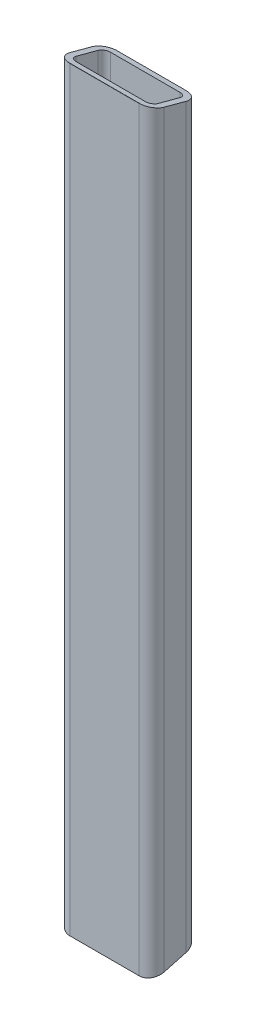
ISO-10303-21;
HEADER;
FILE_DESCRIPTION(('STEP AP214'),'2;1');
FILE_NAME('part.step','',(''),(''),'','','');
FILE_SCHEMA(('AUTOMOTIVE_DESIGN { 1 0 10303 214 1 1 1 1 }'));
ENDSEC;
DATA;
#1=APPLICATION_CONTEXT('core data for automotive mechanical design processes');
#2=APPLICATION_PROTOCOL_DEFINITION('international standard','automotive_design',2000,#1);
#3=PRODUCT_CONTEXT('',#1,'mechanical');
#4=PRODUCT('Part','Part','',(#3));
#5=PRODUCT_RELATED_PRODUCT_CATEGORY('part','',(#4));
#6=PRODUCT_DEFINITION_FORMATION('','',#4);
#7=PRODUCT_DEFINITION_CONTEXT('part definition',#1,'design');
#8=PRODUCT_DEFINITION('design','',#6,#7);
#9=PRODUCT_DEFINITION_SHAPE('','',#8);
#10=(LENGTH_UNIT() NAMED_UNIT(*) SI_UNIT(.MILLI.,.METRE.));
#11=(NAMED_UNIT(*) PLANE_ANGLE_UNIT() SI_UNIT($,.RADIAN.));
#12=(NAMED_UNIT(*) SI_UNIT($,.STERADIAN.) SOLID_ANGLE_UNIT());
#13=UNCERTAINTY_MEASURE_WITH_UNIT(LENGTH_MEASURE(1.E-05),#10,'distance_accuracy_value','');
#14=(GEOMETRIC_REPRESENTATION_CONTEXT(3) GLOBAL_UNCERTAINTY_ASSIGNED_CONTEXT((#13)) GLOBAL_UNIT_ASSIGNED_CONTEXT((#10,
#11,#12)) REPRESENTATION_CONTEXT('',''));
#15=CARTESIAN_POINT('',(0.,0.,0.));
#16=DIRECTION('',(0.,0.,1.));
#17=DIRECTION('',(1.,0.,0.));
#18=AXIS2_PLACEMENT_3D('',#15,#16,#17);
#19=CARTESIAN_POINT('',(-11.,-120.,3.5));
#20=DIRECTION('',(0.,1.,0.));
#21=DIRECTION('',(0.,0.,1.));
#22=AXIS2_PLACEMENT_3D('',#19,#20,#21);
#23=CYLINDRICAL_SURFACE('',#22,4.);
#24=DIRECTION('',(0.,1.,0.));
#25=VECTOR('',#24,1.);
#26=CARTESIAN_POINT('',(-15.,-120.,3.5));
#27=LINE('',#26,#25);
#28=CARTESIAN_POINT('',(-15.,-118.947441116742,3.5));
#29=VERTEX_POINT('',#28);
#30=CARTESIAN_POINT('',(-15.,118.947441116742,3.5));
#31=VERTEX_POINT('',#30);
#32=EDGE_CURVE('E388',#29,#31,#27,.T.);
#33=ORIENTED_EDGE('',*,*,#32,.F.);
#34=CARTESIAN_POINT('',(-11.,-118.947441116742,3.5));
#35=DIRECTION('',(0.,-0.965925826289068,-0.258819045102522));
#36=DIRECTION('',(0.,0.258819045102522,-0.965925826289068));
#37=AXIS2_PLACEMENT_3D('',#34,#35,#36);
#38=ELLIPSE('',#37,4.14110472164033,4.);
#39=CARTESIAN_POINT('',(-11.7544662892754,-120.,7.42820323027551));
#40=VERTEX_POINT('',#39);
#41=EDGE_CURVE('E302',#29,#40,#38,.F.);
#42=ORIENTED_EDGE('',*,*,#41,.T.);
#43=CARTESIAN_POINT('',(-11.,-120.,3.5));
#44=DIRECTION('',(0.,1.,0.));
#45=DIRECTION('',(0.,0.,1.));
#46=AXIS2_PLACEMENT_3D('',#43,#44,#45);
#47=CIRCLE('',#46,4.);
#48=CARTESIAN_POINT('',(-11.,-120.,7.5));
#49=VERTEX_POINT('',#48);
#50=EDGE_CURVE('E366',#40,#49,#47,.T.);
#51=ORIENTED_EDGE('',*,*,#50,.T.);
#52=DIRECTION('',(0.,1.,0.));
#53=VECTOR('',#52,1.);
#54=CARTESIAN_POINT('',(-11.,-120.,7.5));
#55=LINE('',#54,#53);
#56=CARTESIAN_POINT('',(-11.,120.,7.5));
#57=VERTEX_POINT('',#56);
#58=EDGE_CURVE('E387',#49,#57,#55,.T.);
#59=ORIENTED_EDGE('',*,*,#58,.T.);
#60=CARTESIAN_POINT('',(-11.,120.,3.5));
#61=DIRECTION('',(0.,1.,0.));
#62=DIRECTION('',(0.,0.,1.));
#63=AXIS2_PLACEMENT_3D('',#60,#61,#62);
#64=CIRCLE('',#63,4.);
#65=CARTESIAN_POINT('',(-11.7544662892754,120.,7.42820323027552));
#66=VERTEX_POINT('',#65);
#67=EDGE_CURVE('E225',#66,#57,#64,.T.);
#68=ORIENTED_EDGE('',*,*,#67,.F.);
#69=CARTESIAN_POINT('',(-11.,118.947441116742,3.5));
#70=DIRECTION('',(0.,-0.965925826289068,0.258819045102521));
#71=DIRECTION('',(0.,0.258819045102521,0.965925826289068));
#72=AXIS2_PLACEMENT_3D('',#69,#70,#71);
#73=ELLIPSE('',#72,4.14110472164033,4.);
#74=EDGE_CURVE('E296',#66,#31,#73,.T.);
#75=ORIENTED_EDGE('',*,*,#74,.T.);
#76=EDGE_LOOP('',(#33,#42,#51,#59,#68,#75));
#77=FACE_BOUND('',#76,.T.);
#78=ADVANCED_FACE('F140',(#77),#23,.T.);
#79=CARTESIAN_POINT('',(-15.,-120.,-3.5));
#80=DIRECTION('',(-1.,0.,0.));
#81=DIRECTION('',(0.,0.,1.));
#82=AXIS2_PLACEMENT_3D('',#79,#80,#81);
#83=PLANE('',#82);
#84=DIRECTION('',(0.,1.,0.));
#85=VECTOR('',#84,1.);
#86=CARTESIAN_POINT('',(-15.,-120.,-3.5));
#87=LINE('',#86,#85);
#88=CARTESIAN_POINT('',(-15.,-117.071796769724,-3.5));
#89=VERTEX_POINT('',#88);
#90=CARTESIAN_POINT('',(-15.,117.071796769724,-3.5));
#91=VERTEX_POINT('',#90);
#92=EDGE_CURVE('E391',#89,#91,#87,.T.);
#93=ORIENTED_EDGE('',*,*,#92,.F.);
#94=DIRECTION('',(0.,-0.258819045102522,0.965925826289068));
#95=VECTOR('',#94,1.);
#96=CARTESIAN_POINT('',(-15.,-117.267949192431,-2.76794919243112));
#97=LINE('',#96,#95);
#98=EDGE_CURVE('E303',#89,#29,#97,.T.);
#99=ORIENTED_EDGE('',*,*,#98,.T.);
#100=ORIENTED_EDGE('',*,*,#32,.T.);
#101=DIRECTION('',(0.,0.258819045102521,0.965925826289068));
#102=VECTOR('',#101,1.);
#103=CARTESIAN_POINT('',(-15.,101.190997646564,-62.7679491924311));
#104=LINE('',#103,#102);
#105=EDGE_CURVE('E298',#31,#91,#104,.F.);
#106=ORIENTED_EDGE('',*,*,#105,.T.);
#107=EDGE_LOOP('',(#93,#99,#100,#106));
#108=FACE_BOUND('',#107,.T.);
#109=ADVANCED_FACE('F414',(#108),#83,.T.);
#110=CARTESIAN_POINT('',(-11.,-120.,-3.5));
#111=DIRECTION('',(0.,1.,0.));
#112=DIRECTION('',(0.,0.,1.));
#113=AXIS2_PLACEMENT_3D('',#110,#111,#112);
#114=CYLINDRICAL_SURFACE('',#113,4.);
#115=DIRECTION('',(0.,1.,0.));
#116=VECTOR('',#115,1.);
#117=CARTESIAN_POINT('',(-11.,-120.,-7.5));
#118=LINE('',#117,#116);
#119=CARTESIAN_POINT('',(-11.,-116.,-7.5));
#120=VERTEX_POINT('',#119);
#121=CARTESIAN_POINT('',(-11.,116.,-7.5));
#122=VERTEX_POINT('',#121);
#123=EDGE_CURVE('E394',#120,#122,#118,.T.);
#124=ORIENTED_EDGE('',*,*,#123,.F.);
#125=CARTESIAN_POINT('',(-11.,-117.071796769724,-3.5));
#126=DIRECTION('',(0.,-0.965925826289068,-0.258819045102522));
#127=DIRECTION('',(0.,0.258819045102522,-0.965925826289068));
#128=AXIS2_PLACEMENT_3D('',#125,#126,#127);
#129=ELLIPSE('',#128,4.14110472164033,4.);
#130=EDGE_CURVE('E411',#120,#89,#129,.F.);
#131=ORIENTED_EDGE('',*,*,#130,.T.);
#132=ORIENTED_EDGE('',*,*,#92,.T.);
#133=CARTESIAN_POINT('',(-11.,117.071796769724,-3.5));
#134=DIRECTION('',(0.,-0.965925826289068,0.258819045102521));
#135=DIRECTION('',(0.,0.258819045102521,0.965925826289068));
#136=AXIS2_PLACEMENT_3D('',#133,#134,#135);
#137=ELLIPSE('',#136,4.14110472164033,4.);
#138=EDGE_CURVE('E409',#91,#122,#137,.T.);
#139=ORIENTED_EDGE('',*,*,#138,.T.);
#140=EDGE_LOOP('',(#124,#131,#132,#139));
#141=FACE_BOUND('',#140,.T.);
#142=ADVANCED_FACE('F418',(#141),#114,.T.);
#143=CARTESIAN_POINT('',(-11.,-120.,-7.5));
#144=DIRECTION('',(0.,0.,-1.));
#145=DIRECTION('',(-1.,0.,0.));
#146=AXIS2_PLACEMENT_3D('',#143,#144,#145);
#147=PLANE('',#146);
#148=DIRECTION('',(0.,1.,0.));
#149=VECTOR('',#148,1.);
#150=CARTESIAN_POINT('',(11.,-120.,-7.5));
#151=LINE('',#150,#149);
#152=CARTESIAN_POINT('',(11.,-116.,-7.5));
#153=VERTEX_POINT('',#152);
#154=CARTESIAN_POINT('',(11.,116.,-7.5));
#155=VERTEX_POINT('',#154);
#156=EDGE_CURVE('E397',#153,#155,#151,.T.);
#157=ORIENTED_EDGE('',*,*,#156,.F.);
#158=DIRECTION('',(-1.,0.,0.));
#159=VECTOR('',#158,1.);
#160=CARTESIAN_POINT('',(-11.,-116.,-7.5));
#161=LINE('',#160,#159);
#162=EDGE_CURVE('E406',#153,#120,#161,.T.);
#163=ORIENTED_EDGE('',*,*,#162,.T.);
#164=ORIENTED_EDGE('',*,*,#123,.T.);
#165=DIRECTION('',(1.,0.,0.));
#166=VECTOR('',#165,1.);
#167=CARTESIAN_POINT('',(-11.,116.,-7.5));
#168=LINE('',#167,#166);
#169=EDGE_CURVE('E390',#122,#155,#168,.T.);
#170=ORIENTED_EDGE('',*,*,#169,.T.);
#171=EDGE_LOOP('',(#157,#163,#164,#170));
#172=FACE_BOUND('',#171,.T.);
#173=ADVANCED_FACE('F422',(#172),#147,.T.);
#174=CARTESIAN_POINT('',(11.,-120.,-3.5));
#175=DIRECTION('',(0.,1.,0.));
#176=DIRECTION('',(0.,0.,1.));
#177=AXIS2_PLACEMENT_3D('',#174,#175,#176);
#178=CYLINDRICAL_SURFACE('',#177,4.);
#179=DIRECTION('',(0.,1.,0.));
#180=VECTOR('',#179,1.);
#181=CARTESIAN_POINT('',(15.,-120.,-3.5));
#182=LINE('',#181,#180);
#183=CARTESIAN_POINT('',(15.,-117.071796769724,-3.5));
#184=VERTEX_POINT('',#183);
#185=CARTESIAN_POINT('',(15.,117.071796769724,-3.5));
#186=VERTEX_POINT('',#185);
#187=EDGE_CURVE('E399',#184,#186,#182,.T.);
#188=ORIENTED_EDGE('',*,*,#187,.F.);
#189=CARTESIAN_POINT('',(11.,-117.071796769724,-3.5));
#190=DIRECTION('',(0.,-0.965925826289068,-0.258819045102522));
#191=DIRECTION('',(0.,0.258819045102522,-0.965925826289068));
#192=AXIS2_PLACEMENT_3D('',#189,#190,#191);
#193=ELLIPSE('',#192,4.14110472164033,4.);
#194=EDGE_CURVE('E151',#184,#153,#193,.F.);
#195=ORIENTED_EDGE('',*,*,#194,.T.);
#196=ORIENTED_EDGE('',*,*,#156,.T.);
#197=CARTESIAN_POINT('',(11.,117.071796769724,-3.5));
#198=DIRECTION('',(0.,-0.965925826289068,0.258819045102521));
#199=DIRECTION('',(0.,0.258819045102521,0.965925826289068));
#200=AXIS2_PLACEMENT_3D('',#197,#198,#199);
#201=ELLIPSE('',#200,4.14110472164033,4.);
#202=EDGE_CURVE('E160',#155,#186,#201,.T.);
#203=ORIENTED_EDGE('',*,*,#202,.T.);
#204=EDGE_LOOP('',(#188,#195,#196,#203));
#205=FACE_BOUND('',#204,.T.);
#206=ADVANCED_FACE('F424',(#205),#178,.T.);
#207=CARTESIAN_POINT('',(15.,-120.,-3.5));
#208=DIRECTION('',(1.,0.,0.));
#209=DIRECTION('',(0.,0.,-1.));
#210=AXIS2_PLACEMENT_3D('',#207,#208,#209);
#211=PLANE('',#210);
#212=DIRECTION('',(0.,1.,0.));
#213=VECTOR('',#212,1.);
#214=CARTESIAN_POINT('',(15.,-120.,3.5));
#215=LINE('',#214,#213);
#216=CARTESIAN_POINT('',(15.,-118.947441116742,3.5));
#217=VERTEX_POINT('',#216);
#218=CARTESIAN_POINT('',(15.,118.947441116742,3.5));
#219=VERTEX_POINT('',#218);
#220=EDGE_CURVE('E282',#217,#219,#215,.T.);
#221=ORIENTED_EDGE('',*,*,#220,.F.);
#222=DIRECTION('',(0.,0.258819045102522,-0.965925826289068));
#223=VECTOR('',#222,1.);
#224=CARTESIAN_POINT('',(15.,-117.267949192431,-2.76794919243112));
#225=LINE('',#224,#223);
#226=EDGE_CURVE('E313',#217,#184,#225,.T.);
#227=ORIENTED_EDGE('',*,*,#226,.T.);
#228=ORIENTED_EDGE('',*,*,#187,.T.);
#229=DIRECTION('',(0.,-0.258819045102521,-0.965925826289068));
#230=VECTOR('',#229,1.);
#231=CARTESIAN_POINT('',(15.,101.190997646564,-62.7679491924311));
#232=LINE('',#231,#230);
#233=EDGE_CURVE('E311',#186,#219,#232,.F.);
#234=ORIENTED_EDGE('',*,*,#233,.T.);
#235=EDGE_LOOP('',(#221,#227,#228,#234));
#236=FACE_BOUND('',#235,.T.);
#237=ADVANCED_FACE('F440',(#236),#211,.T.);
#238=CARTESIAN_POINT('',(11.,-120.,3.5));
#239=DIRECTION('',(0.,1.,0.));
#240=DIRECTION('',(0.,0.,1.));
#241=AXIS2_PLACEMENT_3D('',#238,#239,#240);
#242=CYLINDRICAL_SURFACE('',#241,4.);
#243=CARTESIAN_POINT('',(11.,-120.,3.5));
#244=DIRECTION('',(0.,1.,0.));
#245=DIRECTION('',(0.,0.,1.));
#246=AXIS2_PLACEMENT_3D('',#243,#244,#245);
#247=CIRCLE('',#246,4.);
#248=CARTESIAN_POINT('',(11.,-120.,7.5));
#249=VERTEX_POINT('',#248);
#250=CARTESIAN_POINT('',(11.7544662892754,-120.,7.42820323027551));
#251=VERTEX_POINT('',#250);
#252=EDGE_CURVE('E385',#249,#251,#247,.T.);
#253=ORIENTED_EDGE('',*,*,#252,.T.);
#254=CARTESIAN_POINT('',(11.,-118.947441116742,3.5));
#255=DIRECTION('',(0.,-0.965925826289068,-0.258819045102522));
#256=DIRECTION('',(0.,0.258819045102522,-0.965925826289068));
#257=AXIS2_PLACEMENT_3D('',#254,#255,#256);
#258=ELLIPSE('',#257,4.14110472164033,4.);
#259=EDGE_CURVE('E286',#251,#217,#258,.F.);
#260=ORIENTED_EDGE('',*,*,#259,.T.);
#261=ORIENTED_EDGE('',*,*,#220,.T.);
#262=CARTESIAN_POINT('',(11.,118.947441116742,3.5));
#263=DIRECTION('',(0.,-0.965925826289068,0.258819045102521));
#264=DIRECTION('',(0.,0.258819045102521,0.965925826289068));
#265=AXIS2_PLACEMENT_3D('',#262,#263,#264);
#266=ELLIPSE('',#265,4.14110472164033,4.);
#267=CARTESIAN_POINT('',(11.7544662892754,120.,7.42820323027552));
#268=VERTEX_POINT('',#267);
#269=EDGE_CURVE('E276',#219,#268,#266,.T.);
#270=ORIENTED_EDGE('',*,*,#269,.T.);
#271=CARTESIAN_POINT('',(11.,120.,3.5));
#272=DIRECTION('',(0.,1.,0.));
#273=DIRECTION('',(0.,0.,1.));
#274=AXIS2_PLACEMENT_3D('',#271,#272,#273);
#275=CIRCLE('',#274,4.);
#276=CARTESIAN_POINT('',(11.,120.,7.5));
#277=VERTEX_POINT('',#276);
#278=EDGE_CURVE('E280',#277,#268,#275,.T.);
#279=ORIENTED_EDGE('',*,*,#278,.F.);
#280=DIRECTION('',(0.,1.,0.));
#281=VECTOR('',#280,1.);
#282=CARTESIAN_POINT('',(11.,-120.,7.5));
#283=LINE('',#282,#281);
#284=EDGE_CURVE('E402',#249,#277,#283,.T.);
#285=ORIENTED_EDGE('',*,*,#284,.F.);
#286=EDGE_LOOP('',(#253,#260,#261,#270,#279,#285));
#287=FACE_BOUND('',#286,.T.);
#288=ADVANCED_FACE('F279',(#287),#242,.T.);
#289=CARTESIAN_POINT('',(-11.,-120.,7.5));
#290=DIRECTION('',(0.,0.,1.));
#291=DIRECTION('',(1.,0.,0.));
#292=AXIS2_PLACEMENT_3D('',#289,#290,#291);
#293=PLANE('',#292);
#294=ORIENTED_EDGE('',*,*,#284,.T.);
#295=DIRECTION('',(1.,0.,0.));
#296=VECTOR('',#295,1.);
#297=CARTESIAN_POINT('',(-11.,120.,7.5));
#298=LINE('',#297,#296);
#299=EDGE_CURVE('E291',#57,#277,#298,.T.);
#300=ORIENTED_EDGE('',*,*,#299,.F.);
#301=ORIENTED_EDGE('',*,*,#58,.F.);
#302=DIRECTION('',(1.,0.,0.));
#303=VECTOR('',#302,1.);
#304=CARTESIAN_POINT('',(-11.,-120.,7.5));
#305=LINE('',#304,#303);
#306=EDGE_CURVE('E382',#49,#249,#305,.T.);
#307=ORIENTED_EDGE('',*,*,#306,.T.);
#308=EDGE_LOOP('',(#294,#300,#301,#307));
#309=FACE_BOUND('',#308,.T.);
#310=ADVANCED_FACE('F447',(#309),#293,.T.);
#311=CARTESIAN_POINT('',(-11.,-120.,3.5));
#312=DIRECTION('',(0.,1.,0.));
#313=DIRECTION('',(0.,0.,1.));
#314=AXIS2_PLACEMENT_3D('',#311,#312,#313);
#315=PLANE('',#314);
#316=ORIENTED_EDGE('',*,*,#50,.F.);
#317=DIRECTION('',(1.,0.,0.));
#318=VECTOR('',#317,1.);
#319=CARTESIAN_POINT('',(11.,-120.,7.42820323027551));
#320=LINE('',#319,#318);
#321=EDGE_CURVE('E287',#40,#251,#320,.T.);
#322=ORIENTED_EDGE('',*,*,#321,.T.);
#323=ORIENTED_EDGE('',*,*,#252,.F.);
#324=ORIENTED_EDGE('',*,*,#306,.F.);
#325=EDGE_LOOP('',(#316,#322,#323,#324));
#326=FACE_BOUND('',#325,.T.);
#327=ADVANCED_FACE('F437',(#326),#315,.F.);
#328=CARTESIAN_POINT('',(-11.,-120.,3.5));
#329=DIRECTION('',(0.,1.,0.));
#330=DIRECTION('',(0.,0.,1.));
#331=AXIS2_PLACEMENT_3D('',#328,#329,#330);
#332=CYLINDRICAL_SURFACE('',#331,2.);
#333=DIRECTION('',(0.,1.,0.));
#334=VECTOR('',#333,1.);
#335=CARTESIAN_POINT('',(-13.,-120.,3.5));
#336=LINE('',#335,#334);
#337=CARTESIAN_POINT('',(-13.,-118.947441116742,3.5));
#338=VERTEX_POINT('',#337);
#339=CARTESIAN_POINT('',(-13.,118.947441116742,3.5));
#340=VERTEX_POINT('',#339);
#341=EDGE_CURVE('E218',#338,#340,#336,.T.);
#342=ORIENTED_EDGE('',*,*,#341,.T.);
#343=CARTESIAN_POINT('',(-11.,118.947441116742,3.5));
#344=DIRECTION('',(0.,-0.965925826289068,0.258819045102521));
#345=DIRECTION('',(0.,0.258819045102521,0.965925826289068));
#346=AXIS2_PLACEMENT_3D('',#343,#344,#345);
#347=ELLIPSE('',#346,2.07055236082017,2.);
#348=CARTESIAN_POINT('',(-11.,119.483339501604,5.5));
#349=VERTEX_POINT('',#348);
#350=EDGE_CURVE('E145',#340,#349,#347,.F.);
#351=ORIENTED_EDGE('',*,*,#350,.T.);
#352=DIRECTION('',(0.,1.,0.));
#353=VECTOR('',#352,1.);
#354=CARTESIAN_POINT('',(-11.,-120.,5.5));
#355=LINE('',#354,#353);
#356=CARTESIAN_POINT('',(-11.,-119.483339501605,5.5));
#357=VERTEX_POINT('',#356);
#358=EDGE_CURVE('E320',#357,#349,#355,.T.);
#359=ORIENTED_EDGE('',*,*,#358,.F.);
#360=CARTESIAN_POINT('',(-11.,-118.947441116742,3.5));
#361=DIRECTION('',(0.,-0.965925826289068,-0.258819045102522));
#362=DIRECTION('',(0.,0.258819045102522,-0.965925826289068));
#363=AXIS2_PLACEMENT_3D('',#360,#361,#362);
#364=ELLIPSE('',#363,2.07055236082017,2.);
#365=EDGE_CURVE('E292',#338,#357,#364,.F.);
#366=ORIENTED_EDGE('',*,*,#365,.F.);
#367=EDGE_LOOP('',(#342,#351,#359,#366));
#368=FACE_BOUND('',#367,.T.);
#369=ADVANCED_FACE('F478',(#368),#332,.F.);
#370=CARTESIAN_POINT('',(-13.,-120.,-3.5));
#371=DIRECTION('',(-1.,0.,0.));
#372=DIRECTION('',(0.,0.,1.));
#373=AXIS2_PLACEMENT_3D('',#370,#371,#372);
#374=PLANE('',#373);
#375=DIRECTION('',(0.,1.,0.));
#376=VECTOR('',#375,1.);
#377=CARTESIAN_POINT('',(-13.,-120.,-3.5));
#378=LINE('',#377,#376);
#379=CARTESIAN_POINT('',(-13.,-117.071796769724,-3.5));
#380=VERTEX_POINT('',#379);
#381=CARTESIAN_POINT('',(-13.,117.071796769724,-3.5));
#382=VERTEX_POINT('',#381);
#383=EDGE_CURVE('E367',#380,#382,#378,.T.);
#384=ORIENTED_EDGE('',*,*,#383,.T.);
#385=DIRECTION('',(0.,-0.258819045102521,-0.965925826289068));
#386=VECTOR('',#385,1.);
#387=CARTESIAN_POINT('',(-13.,120.,7.42820323027552));
#388=LINE('',#387,#386);
#389=EDGE_CURVE('E358',#382,#340,#388,.F.);
#390=ORIENTED_EDGE('',*,*,#389,.T.);
#391=ORIENTED_EDGE('',*,*,#341,.F.);
#392=DIRECTION('',(0.,-0.258819045102522,0.965925826289068));
#393=VECTOR('',#392,1.);
#394=CARTESIAN_POINT('',(-13.,-117.267949192431,-2.76794919243112));
#395=LINE('',#394,#393);
#396=EDGE_CURVE('E317',#380,#338,#395,.T.);
#397=ORIENTED_EDGE('',*,*,#396,.F.);
#398=EDGE_LOOP('',(#384,#390,#391,#397));
#399=FACE_BOUND('',#398,.T.);
#400=ADVANCED_FACE('F474',(#399),#374,.F.);
#401=CARTESIAN_POINT('',(-11.,-120.,-3.5));
#402=DIRECTION('',(0.,1.,0.));
#403=DIRECTION('',(0.,0.,1.));
#404=AXIS2_PLACEMENT_3D('',#401,#402,#403);
#405=CYLINDRICAL_SURFACE('',#404,2.);
#406=DIRECTION('',(0.,1.,0.));
#407=VECTOR('',#406,1.);
#408=CARTESIAN_POINT('',(-11.,-120.,-5.5));
#409=LINE('',#408,#407);
#410=CARTESIAN_POINT('',(-11.,-116.535898384862,-5.5));
#411=VERTEX_POINT('',#410);
#412=CARTESIAN_POINT('',(-11.,116.535898384862,-5.5));
#413=VERTEX_POINT('',#412);
#414=EDGE_CURVE('E369',#411,#413,#409,.T.);
#415=ORIENTED_EDGE('',*,*,#414,.T.);
#416=CARTESIAN_POINT('',(-11.,117.071796769724,-3.5));
#417=DIRECTION('',(0.,-0.965925826289068,0.258819045102521));
#418=DIRECTION('',(0.,0.258819045102521,0.965925826289068));
#419=AXIS2_PLACEMENT_3D('',#416,#417,#418);
#420=ELLIPSE('',#419,2.07055236082017,2.);
#421=EDGE_CURVE('E356',#413,#382,#420,.F.);
#422=ORIENTED_EDGE('',*,*,#421,.T.);
#423=ORIENTED_EDGE('',*,*,#383,.F.);
#424=CARTESIAN_POINT('',(-11.,-117.071796769724,-3.5));
#425=DIRECTION('',(0.,-0.965925826289068,-0.258819045102522));
#426=DIRECTION('',(0.,0.258819045102522,-0.965925826289068));
#427=AXIS2_PLACEMENT_3D('',#424,#425,#426);
#428=ELLIPSE('',#427,2.07055236082017,2.);
#429=EDGE_CURVE('E321',#411,#380,#428,.F.);
#430=ORIENTED_EDGE('',*,*,#429,.F.);
#431=EDGE_LOOP('',(#415,#422,#423,#430));
#432=FACE_BOUND('',#431,.T.);
#433=ADVANCED_FACE('F477',(#432),#405,.F.);
#434=CARTESIAN_POINT('',(-11.,-120.,-5.5));
#435=DIRECTION('',(0.,0.,-1.));
#436=DIRECTION('',(-1.,0.,0.));
#437=AXIS2_PLACEMENT_3D('',#434,#435,#436);
#438=PLANE('',#437);
#439=DIRECTION('',(0.,1.,0.));
#440=VECTOR('',#439,1.);
#441=CARTESIAN_POINT('',(11.,-120.,-5.5));
#442=LINE('',#441,#440);
#443=CARTESIAN_POINT('',(11.,-116.535898384862,-5.5));
#444=VERTEX_POINT('',#443);
#445=CARTESIAN_POINT('',(11.,116.535898384862,-5.5));
#446=VERTEX_POINT('',#445);
#447=EDGE_CURVE('E371',#444,#446,#442,.T.);
#448=ORIENTED_EDGE('',*,*,#447,.T.);
#449=DIRECTION('',(1.,0.,0.));
#450=VECTOR('',#449,1.);
#451=CARTESIAN_POINT('',(-11.,116.535898384862,-5.5));
#452=LINE('',#451,#450);
#453=EDGE_CURVE('E353',#446,#413,#452,.F.);
#454=ORIENTED_EDGE('',*,*,#453,.T.);
#455=ORIENTED_EDGE('',*,*,#414,.F.);
#456=DIRECTION('',(-1.,0.,0.));
#457=VECTOR('',#456,1.);
#458=CARTESIAN_POINT('',(-11.,-116.535898384862,-5.5));
#459=LINE('',#458,#457);
#460=EDGE_CURVE('E324',#444,#411,#459,.T.);
#461=ORIENTED_EDGE('',*,*,#460,.F.);
#462=EDGE_LOOP('',(#448,#454,#455,#461));
#463=FACE_BOUND('',#462,.T.);
#464=ADVANCED_FACE('F481',(#463),#438,.F.);
#465=CARTESIAN_POINT('',(11.,-120.,-3.5));
#466=DIRECTION('',(0.,1.,0.));
#467=DIRECTION('',(0.,0.,1.));
#468=AXIS2_PLACEMENT_3D('',#465,#466,#467);
#469=CYLINDRICAL_SURFACE('',#468,2.);
#470=DIRECTION('',(0.,1.,0.));
#471=VECTOR('',#470,1.);
#472=CARTESIAN_POINT('',(13.,-120.,-3.5));
#473=LINE('',#472,#471);
#474=CARTESIAN_POINT('',(13.,-117.071796769724,-3.5));
#475=VERTEX_POINT('',#474);
#476=CARTESIAN_POINT('',(13.,117.071796769724,-3.5));
#477=VERTEX_POINT('',#476);
#478=EDGE_CURVE('E373',#475,#477,#473,.T.);
#479=ORIENTED_EDGE('',*,*,#478,.T.);
#480=CARTESIAN_POINT('',(11.,117.071796769724,-3.5));
#481=DIRECTION('',(0.,-0.965925826289068,0.258819045102521));
#482=DIRECTION('',(0.,0.258819045102521,0.965925826289068));
#483=AXIS2_PLACEMENT_3D('',#480,#481,#482);
#484=ELLIPSE('',#483,2.07055236082017,2.);
#485=EDGE_CURVE('E350',#477,#446,#484,.F.);
#486=ORIENTED_EDGE('',*,*,#485,.T.);
#487=ORIENTED_EDGE('',*,*,#447,.F.);
#488=CARTESIAN_POINT('',(11.,-117.071796769724,-3.5));
#489=DIRECTION('',(0.,-0.965925826289068,-0.258819045102522));
#490=DIRECTION('',(0.,0.258819045102522,-0.965925826289068));
#491=AXIS2_PLACEMENT_3D('',#488,#489,#490);
#492=ELLIPSE('',#491,2.07055236082017,2.);
#493=EDGE_CURVE('E327',#475,#444,#492,.F.);
#494=ORIENTED_EDGE('',*,*,#493,.F.);
#495=EDGE_LOOP('',(#479,#486,#487,#494));
#496=FACE_BOUND('',#495,.T.);
#497=ADVANCED_FACE('F485',(#496),#469,.F.);
#498=CARTESIAN_POINT('',(13.,-120.,-3.5));
#499=DIRECTION('',(1.,0.,0.));
#500=DIRECTION('',(0.,0.,-1.));
#501=AXIS2_PLACEMENT_3D('',#498,#499,#500);
#502=PLANE('',#501);
#503=DIRECTION('',(0.,1.,0.));
#504=VECTOR('',#503,1.);
#505=CARTESIAN_POINT('',(13.,-120.,3.5));
#506=LINE('',#505,#504);
#507=CARTESIAN_POINT('',(13.,-118.947441116742,3.5));
#508=VERTEX_POINT('',#507);
#509=CARTESIAN_POINT('',(13.,118.947441116742,3.5));
#510=VERTEX_POINT('',#509);
#511=EDGE_CURVE('E375',#508,#510,#506,.T.);
#512=ORIENTED_EDGE('',*,*,#511,.T.);
#513=DIRECTION('',(0.,0.258819045102521,0.965925826289068));
#514=VECTOR('',#513,1.);
#515=CARTESIAN_POINT('',(13.,120.,7.42820323027551));
#516=LINE('',#515,#514);
#517=EDGE_CURVE('E347',#510,#477,#516,.F.);
#518=ORIENTED_EDGE('',*,*,#517,.T.);
#519=ORIENTED_EDGE('',*,*,#478,.F.);
#520=DIRECTION('',(0.,0.258819045102522,-0.965925826289068));
#521=VECTOR('',#520,1.);
#522=CARTESIAN_POINT('',(13.,-117.267949192431,-2.76794919243112));
#523=LINE('',#522,#521);
#524=EDGE_CURVE('E330',#508,#475,#523,.T.);
#525=ORIENTED_EDGE('',*,*,#524,.F.);
#526=EDGE_LOOP('',(#512,#518,#519,#525));
#527=FACE_BOUND('',#526,.T.);
#528=ADVANCED_FACE('F489',(#527),#502,.F.);
#529=CARTESIAN_POINT('',(11.,-120.,3.5));
#530=DIRECTION('',(0.,1.,0.));
#531=DIRECTION('',(0.,0.,1.));
#532=AXIS2_PLACEMENT_3D('',#529,#530,#531);
#533=CYLINDRICAL_SURFACE('',#532,2.);
#534=DIRECTION('',(0.,1.,0.));
#535=VECTOR('',#534,1.);
#536=CARTESIAN_POINT('',(11.,-120.,5.5));
#537=LINE('',#536,#535);
#538=CARTESIAN_POINT('',(11.,-119.483339501605,5.5));
#539=VERTEX_POINT('',#538);
#540=CARTESIAN_POINT('',(11.,119.483339501604,5.5));
#541=VERTEX_POINT('',#540);
#542=EDGE_CURVE('E377',#539,#541,#537,.T.);
#543=ORIENTED_EDGE('',*,*,#542,.T.);
#544=CARTESIAN_POINT('',(11.,118.947441116742,3.5));
#545=DIRECTION('',(0.,-0.965925826289068,0.258819045102521));
#546=DIRECTION('',(0.,0.258819045102521,0.965925826289068));
#547=AXIS2_PLACEMENT_3D('',#544,#545,#546);
#548=ELLIPSE('',#547,2.07055236082017,2.);
#549=EDGE_CURVE('E344',#541,#510,#548,.F.);
#550=ORIENTED_EDGE('',*,*,#549,.T.);
#551=ORIENTED_EDGE('',*,*,#511,.F.);
#552=CARTESIAN_POINT('',(11.,-118.947441116742,3.5));
#553=DIRECTION('',(0.,-0.965925826289068,-0.258819045102522));
#554=DIRECTION('',(0.,0.258819045102522,-0.965925826289068));
#555=AXIS2_PLACEMENT_3D('',#552,#553,#554);
#556=ELLIPSE('',#555,2.07055236082017,2.);
#557=EDGE_CURVE('E333',#539,#508,#556,.F.);
#558=ORIENTED_EDGE('',*,*,#557,.F.);
#559=EDGE_LOOP('',(#543,#550,#551,#558));
#560=FACE_BOUND('',#559,.T.);
#561=ADVANCED_FACE('F470',(#560),#533,.F.);
#562=CARTESIAN_POINT('',(-11.,-120.,5.5));
#563=DIRECTION('',(0.,0.,1.));
#564=DIRECTION('',(1.,0.,0.));
#565=AXIS2_PLACEMENT_3D('',#562,#563,#564);
#566=PLANE('',#565);
#567=ORIENTED_EDGE('',*,*,#358,.T.);
#568=DIRECTION('',(-1.,0.,0.));
#569=VECTOR('',#568,1.);
#570=CARTESIAN_POINT('',(-11.,119.483339501604,5.5));
#571=LINE('',#570,#569);
#572=EDGE_CURVE('E341',#349,#541,#571,.F.);
#573=ORIENTED_EDGE('',*,*,#572,.T.);
#574=ORIENTED_EDGE('',*,*,#542,.F.);
#575=DIRECTION('',(1.,0.,0.));
#576=VECTOR('',#575,1.);
#577=CARTESIAN_POINT('',(-11.,-119.483339501605,5.5));
#578=LINE('',#577,#576);
#579=EDGE_CURVE('E336',#357,#539,#578,.T.);
#580=ORIENTED_EDGE('',*,*,#579,.F.);
#581=EDGE_LOOP('',(#567,#573,#574,#580));
#582=FACE_BOUND('',#581,.T.);
#583=ADVANCED_FACE('F465',(#582),#566,.F.);
#584=CARTESIAN_POINT('',(-11.,120.,3.5));
#585=DIRECTION('',(0.,1.,0.));
#586=DIRECTION('',(0.,0.,1.));
#587=AXIS2_PLACEMENT_3D('',#584,#585,#586);
#588=PLANE('',#587);
#589=ORIENTED_EDGE('',*,*,#278,.T.);
#590=DIRECTION('',(-1.,0.,0.));
#591=VECTOR('',#590,1.);
#592=CARTESIAN_POINT('',(-11.,120.,7.42820323027552));
#593=LINE('',#592,#591);
#594=EDGE_CURVE('E12',#268,#66,#593,.T.);
#595=ORIENTED_EDGE('',*,*,#594,.T.);
#596=ORIENTED_EDGE('',*,*,#67,.T.);
#597=ORIENTED_EDGE('',*,*,#299,.T.);
#598=EDGE_LOOP('',(#589,#595,#596,#597));
#599=FACE_BOUND('',#598,.T.);
#600=ADVANCED_FACE('F289',(#599),#588,.T.);
#601=CARTESIAN_POINT('',(-11.,-116.,-7.5));
#602=DIRECTION('',(0.,-0.965925826289068,-0.258819045102522));
#603=DIRECTION('',(1.,0.,0.));
#604=AXIS2_PLACEMENT_3D('',#601,#602,#603);
#605=PLANE('',#604);
#606=ORIENTED_EDGE('',*,*,#259,.F.);
#607=ORIENTED_EDGE('',*,*,#321,.F.);
#608=ORIENTED_EDGE('',*,*,#41,.F.);
#609=ORIENTED_EDGE('',*,*,#98,.F.);
#610=ORIENTED_EDGE('',*,*,#130,.F.);
#611=ORIENTED_EDGE('',*,*,#162,.F.);
#612=ORIENTED_EDGE('',*,*,#194,.F.);
#613=ORIENTED_EDGE('',*,*,#226,.F.);
#614=EDGE_LOOP('',(#606,#607,#608,#609,#610,#611,#612,#613));
#615=FACE_BOUND('',#614,.T.);
#616=ORIENTED_EDGE('',*,*,#396,.T.);
#617=ORIENTED_EDGE('',*,*,#365,.T.);
#618=ORIENTED_EDGE('',*,*,#579,.T.);
#619=ORIENTED_EDGE('',*,*,#557,.T.);
#620=ORIENTED_EDGE('',*,*,#524,.T.);
#621=ORIENTED_EDGE('',*,*,#493,.T.);
#622=ORIENTED_EDGE('',*,*,#460,.T.);
#623=ORIENTED_EDGE('',*,*,#429,.T.);
#624=EDGE_LOOP('',(#616,#617,#618,#619,#620,#621,#622,#623));
#625=FACE_BOUND('',#624,.T.);
#626=ADVANCED_FACE('F429',(#615,#625),#605,.T.);
#627=CARTESIAN_POINT('',(-11.,120.,7.42820323027552));
#628=DIRECTION('',(0.,-0.965925826289068,0.258819045102521));
#629=DIRECTION('',(-1.,0.,0.));
#630=AXIS2_PLACEMENT_3D('',#627,#628,#629);
#631=PLANE('',#630);
#632=ORIENTED_EDGE('',*,*,#202,.F.);
#633=ORIENTED_EDGE('',*,*,#169,.F.);
#634=ORIENTED_EDGE('',*,*,#138,.F.);
#635=ORIENTED_EDGE('',*,*,#105,.F.);
#636=ORIENTED_EDGE('',*,*,#74,.F.);
#637=ORIENTED_EDGE('',*,*,#594,.F.);
#638=ORIENTED_EDGE('',*,*,#269,.F.);
#639=ORIENTED_EDGE('',*,*,#233,.F.);
#640=EDGE_LOOP('',(#632,#633,#634,#635,#636,#637,#638,#639));
#641=FACE_BOUND('',#640,.T.);
#642=ORIENTED_EDGE('',*,*,#572,.F.);
#643=ORIENTED_EDGE('',*,*,#350,.F.);
#644=ORIENTED_EDGE('',*,*,#389,.F.);
#645=ORIENTED_EDGE('',*,*,#421,.F.);
#646=ORIENTED_EDGE('',*,*,#453,.F.);
#647=ORIENTED_EDGE('',*,*,#485,.F.);
#648=ORIENTED_EDGE('',*,*,#517,.F.);
#649=ORIENTED_EDGE('',*,*,#549,.F.);
#650=EDGE_LOOP('',(#642,#643,#644,#645,#646,#647,#648,#649));
#651=FACE_BOUND('',#650,.T.);
#652=ADVANCED_FACE('F143',(#641,#651),#631,.F.);
#653=CLOSED_SHELL('',(#78,#109,#142,#173,#206,#237,#288,#310,#327,#369,#400,#433,#464,#497,#528,
#561,#583,#600,#626,#652));
#654=MANIFOLD_SOLID_BREP('B2',#653);
#655=ADVANCED_BREP_SHAPE_REPRESENTATION('',(#18,#654),#14);
#656=SHAPE_DEFINITION_REPRESENTATION(#9,#655);
ENDSEC;
END-ISO-10303-21;
